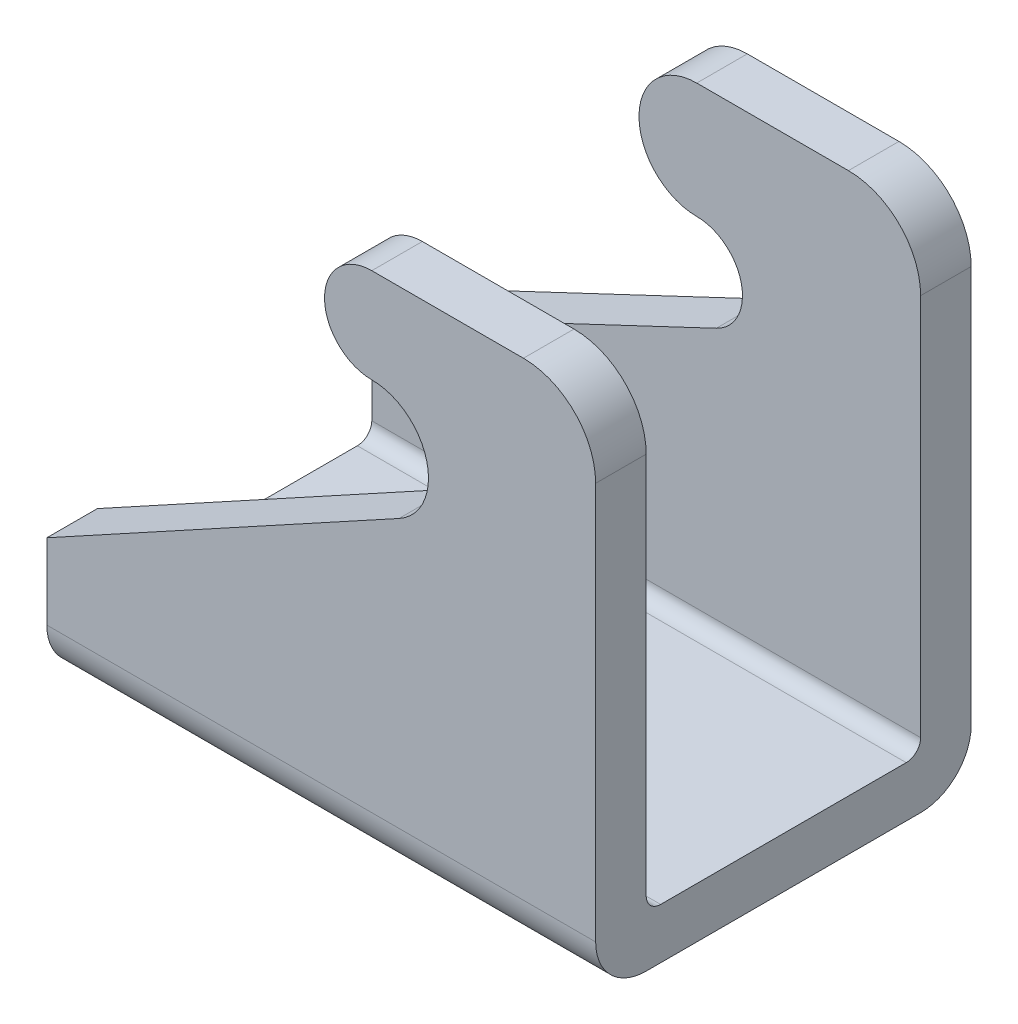
ISO-10303-21;
HEADER;
FILE_DESCRIPTION(('STEP AP214'),'2;1');
FILE_NAME('part.step','',(''),(''),'','','');
FILE_SCHEMA(('AUTOMOTIVE_DESIGN { 1 0 10303 214 1 1 1 1 }'));
ENDSEC;
DATA;
#1=APPLICATION_CONTEXT('core data for automotive mechanical design processes');
#2=APPLICATION_PROTOCOL_DEFINITION('international standard','automotive_design',2000,#1);
#3=PRODUCT_CONTEXT('',#1,'mechanical');
#4=PRODUCT('Part','Part','',(#3));
#5=PRODUCT_RELATED_PRODUCT_CATEGORY('part','',(#4));
#6=PRODUCT_DEFINITION_FORMATION('','',#4);
#7=PRODUCT_DEFINITION_CONTEXT('part definition',#1,'design');
#8=PRODUCT_DEFINITION('design','',#6,#7);
#9=PRODUCT_DEFINITION_SHAPE('','',#8);
#10=(LENGTH_UNIT() NAMED_UNIT(*) SI_UNIT(.MILLI.,.METRE.));
#11=(NAMED_UNIT(*) PLANE_ANGLE_UNIT() SI_UNIT($,.RADIAN.));
#12=(NAMED_UNIT(*) SI_UNIT($,.STERADIAN.) SOLID_ANGLE_UNIT());
#13=UNCERTAINTY_MEASURE_WITH_UNIT(LENGTH_MEASURE(1.E-05),#10,'distance_accuracy_value','');
#14=(GEOMETRIC_REPRESENTATION_CONTEXT(3) GLOBAL_UNCERTAINTY_ASSIGNED_CONTEXT((#13)) GLOBAL_UNIT_ASSIGNED_CONTEXT((#10,
#11,#12)) REPRESENTATION_CONTEXT('',''));
#15=CARTESIAN_POINT('',(0.,0.,0.));
#16=DIRECTION('',(0.,0.,1.));
#17=DIRECTION('',(1.,0.,0.));
#18=AXIS2_PLACEMENT_3D('',#15,#16,#17);
#19=CARTESIAN_POINT('',(38.,36.,-13.));
#20=DIRECTION('',(0.,1.,0.));
#21=DIRECTION('',(0.,0.,1.));
#22=AXIS2_PLACEMENT_3D('',#19,#20,#21);
#23=PLANE('',#22);
#24=DIRECTION('',(1.,0.,0.));
#25=VECTOR('',#24,1.);
#26=CARTESIAN_POINT('',(0.,36.,-9.5));
#27=LINE('',#26,#25);
#28=CARTESIAN_POINT('',(22.5,36.,-9.49999999999999));
#29=VERTEX_POINT('',#28);
#30=CARTESIAN_POINT('',(33.,36.,-9.5));
#31=VERTEX_POINT('',#30);
#32=EDGE_CURVE('E193',#29,#31,#27,.T.);
#33=ORIENTED_EDGE('',*,*,#32,.T.);
#34=DIRECTION('',(0.,0.,1.));
#35=VECTOR('',#34,1.);
#36=CARTESIAN_POINT('',(33.,36.,-13.));
#37=LINE('',#36,#35);
#38=CARTESIAN_POINT('',(33.,36.,-13.));
#39=VERTEX_POINT('',#38);
#40=EDGE_CURVE('E42',#31,#39,#37,.F.);
#41=ORIENTED_EDGE('',*,*,#40,.T.);
#42=DIRECTION('',(-1.,0.,0.));
#43=VECTOR('',#42,1.);
#44=CARTESIAN_POINT('',(38.,36.,-13.));
#45=LINE('',#44,#43);
#46=CARTESIAN_POINT('',(22.5,36.,-13.));
#47=VERTEX_POINT('',#46);
#48=EDGE_CURVE('E251',#39,#47,#45,.T.);
#49=ORIENTED_EDGE('',*,*,#48,.T.);
#50=DIRECTION('',(0.,0.,-1.));
#51=VECTOR('',#50,1.);
#52=CARTESIAN_POINT('',(22.5,36.,13.001));
#53=LINE('',#52,#51);
#54=EDGE_CURVE('E190',#29,#47,#53,.T.);
#55=ORIENTED_EDGE('',*,*,#54,.F.);
#56=EDGE_LOOP('',(#33,#41,#49,#55));
#57=FACE_BOUND('',#56,.T.);
#58=ADVANCED_FACE('F34',(#57),#23,.T.);
#59=DIRECTION('',(-1.,0.,0.));
#60=VECTOR('',#59,1.);
#61=CARTESIAN_POINT('',(38.,36.,13.));
#62=LINE('',#61,#60);
#63=CARTESIAN_POINT('',(33.,36.,13.));
#64=VERTEX_POINT('',#63);
#65=CARTESIAN_POINT('',(22.5,36.,13.));
#66=VERTEX_POINT('',#65);
#67=EDGE_CURVE('E248',#64,#66,#62,.T.);
#68=ORIENTED_EDGE('',*,*,#67,.F.);
#69=DIRECTION('',(0.,0.,1.));
#70=VECTOR('',#69,1.);
#71=CARTESIAN_POINT('',(33.,36.,-13.));
#72=LINE('',#71,#70);
#73=CARTESIAN_POINT('',(33.,36.,9.5));
#74=VERTEX_POINT('',#73);
#75=EDGE_CURVE('E317',#64,#74,#72,.F.);
#76=ORIENTED_EDGE('',*,*,#75,.T.);
#77=DIRECTION('',(1.,0.,0.));
#78=VECTOR('',#77,1.);
#79=CARTESIAN_POINT('',(0.,36.,9.5));
#80=LINE('',#79,#78);
#81=CARTESIAN_POINT('',(22.5,36.,9.49999999999999));
#82=VERTEX_POINT('',#81);
#83=EDGE_CURVE('E241',#82,#74,#80,.T.);
#84=ORIENTED_EDGE('',*,*,#83,.F.);
#85=DIRECTION('',(0.,0.,1.));
#86=VECTOR('',#85,1.);
#87=CARTESIAN_POINT('',(22.5,36.,-13.001));
#88=LINE('',#87,#86);
#89=EDGE_CURVE('E214',#82,#66,#88,.T.);
#90=ORIENTED_EDGE('',*,*,#89,.T.);
#91=EDGE_LOOP('',(#68,#76,#84,#90));
#92=FACE_BOUND('',#91,.T.);
#93=ADVANCED_FACE('F341',(#92),#23,.T.);
#94=CARTESIAN_POINT('',(38.,0.,-13.));
#95=DIRECTION('',(1.,0.,0.));
#96=DIRECTION('',(0.,0.,-1.));
#97=AXIS2_PLACEMENT_3D('',#94,#95,#96);
#98=PLANE('',#97);
#99=DIRECTION('',(0.,-1.,0.));
#100=VECTOR('',#99,1.);
#101=CARTESIAN_POINT('',(38.,36.,9.5));
#102=LINE('',#101,#100);
#103=CARTESIAN_POINT('',(38.,31.,9.5));
#104=VERTEX_POINT('',#103);
#105=CARTESIAN_POINT('',(38.,4.5,9.5));
#106=VERTEX_POINT('',#105);
#107=EDGE_CURVE('E231',#104,#106,#102,.T.);
#108=ORIENTED_EDGE('',*,*,#107,.F.);
#109=DIRECTION('',(0.,0.,1.));
#110=VECTOR('',#109,1.);
#111=CARTESIAN_POINT('',(38.,31.,-13.));
#112=LINE('',#111,#110);
#113=CARTESIAN_POINT('',(38.,31.,13.));
#114=VERTEX_POINT('',#113);
#115=EDGE_CURVE('E312',#104,#114,#112,.T.);
#116=ORIENTED_EDGE('',*,*,#115,.T.);
#117=DIRECTION('',(0.,1.,0.));
#118=VECTOR('',#117,1.);
#119=CARTESIAN_POINT('',(38.,0.,13.));
#120=LINE('',#119,#118);
#121=CARTESIAN_POINT('',(38.,3.5,13.));
#122=VERTEX_POINT('',#121);
#123=EDGE_CURVE('E254',#122,#114,#120,.T.);
#124=ORIENTED_EDGE('',*,*,#123,.F.);
#125=CARTESIAN_POINT('',(38.,3.5,9.5));
#126=DIRECTION('',(1.,0.,0.));
#127=DIRECTION('',(0.,0.,-1.));
#128=AXIS2_PLACEMENT_3D('',#125,#126,#127);
#129=CIRCLE('',#128,3.5);
#130=CARTESIAN_POINT('',(38.,0.,9.5));
#131=VERTEX_POINT('',#130);
#132=EDGE_CURVE('E296',#122,#131,#129,.T.);
#133=ORIENTED_EDGE('',*,*,#132,.T.);
#134=DIRECTION('',(0.,0.,1.));
#135=VECTOR('',#134,1.);
#136=CARTESIAN_POINT('',(38.,0.,-13.));
#137=LINE('',#136,#135);
#138=CARTESIAN_POINT('',(38.,0.,-9.5));
#139=VERTEX_POINT('',#138);
#140=EDGE_CURVE('E267',#139,#131,#137,.T.);
#141=ORIENTED_EDGE('',*,*,#140,.F.);
#142=CARTESIAN_POINT('',(38.,3.5,-9.5));
#143=DIRECTION('',(1.,0.,0.));
#144=DIRECTION('',(0.,0.,-1.));
#145=AXIS2_PLACEMENT_3D('',#142,#143,#144);
#146=CIRCLE('',#145,3.5);
#147=CARTESIAN_POINT('',(38.,3.5,-13.));
#148=VERTEX_POINT('',#147);
#149=EDGE_CURVE('E294',#139,#148,#146,.T.);
#150=ORIENTED_EDGE('',*,*,#149,.T.);
#151=DIRECTION('',(0.,1.,0.));
#152=VECTOR('',#151,1.);
#153=CARTESIAN_POINT('',(38.,0.,-13.));
#154=LINE('',#153,#152);
#155=CARTESIAN_POINT('',(38.,31.,-13.));
#156=VERTEX_POINT('',#155);
#157=EDGE_CURVE('E257',#148,#156,#154,.T.);
#158=ORIENTED_EDGE('',*,*,#157,.T.);
#159=DIRECTION('',(0.,0.,1.));
#160=VECTOR('',#159,1.);
#161=CARTESIAN_POINT('',(38.,31.,-13.));
#162=LINE('',#161,#160);
#163=CARTESIAN_POINT('',(38.,31.,-9.5));
#164=VERTEX_POINT('',#163);
#165=EDGE_CURVE('E309',#156,#164,#162,.T.);
#166=ORIENTED_EDGE('',*,*,#165,.T.);
#167=DIRECTION('',(0.,1.,0.));
#168=VECTOR('',#167,1.);
#169=CARTESIAN_POINT('',(38.,3.5,-9.5));
#170=LINE('',#169,#168);
#171=CARTESIAN_POINT('',(38.,4.5,-9.5));
#172=VERTEX_POINT('',#171);
#173=EDGE_CURVE('E236',#172,#164,#170,.T.);
#174=ORIENTED_EDGE('',*,*,#173,.F.);
#175=CARTESIAN_POINT('',(38.,4.5,-8.5));
#176=DIRECTION('',(1.,0.,0.));
#177=DIRECTION('',(0.,0.,-1.));
#178=AXIS2_PLACEMENT_3D('',#175,#176,#177);
#179=CIRCLE('',#178,1.);
#180=CARTESIAN_POINT('',(38.,3.5,-8.5));
#181=VERTEX_POINT('',#180);
#182=EDGE_CURVE('E282',#172,#181,#179,.F.);
#183=ORIENTED_EDGE('',*,*,#182,.T.);
#184=DIRECTION('',(0.,0.,-1.));
#185=VECTOR('',#184,1.);
#186=CARTESIAN_POINT('',(38.,3.5,9.5));
#187=LINE('',#186,#185);
#188=CARTESIAN_POINT('',(38.,3.5,8.5));
#189=VERTEX_POINT('',#188);
#190=EDGE_CURVE('E243',#189,#181,#187,.T.);
#191=ORIENTED_EDGE('',*,*,#190,.F.);
#192=CARTESIAN_POINT('',(38.,4.5,8.5));
#193=DIRECTION('',(1.,0.,0.));
#194=DIRECTION('',(0.,0.,-1.));
#195=AXIS2_PLACEMENT_3D('',#192,#193,#194);
#196=CIRCLE('',#195,1.);
#197=EDGE_CURVE('E286',#189,#106,#196,.F.);
#198=ORIENTED_EDGE('',*,*,#197,.T.);
#199=EDGE_LOOP('',(#108,#116,#124,#133,#141,#150,#158,#166,#174,#183,#191,#198));
#200=FACE_BOUND('',#199,.T.);
#201=ADVANCED_FACE('F331',(#200),#98,.T.);
#202=CARTESIAN_POINT('',(0.,0.,-13.));
#203=DIRECTION('',(0.,-1.,0.));
#204=DIRECTION('',(0.,0.,-1.));
#205=AXIS2_PLACEMENT_3D('',#202,#203,#204);
#206=PLANE('',#205);
#207=ORIENTED_EDGE('',*,*,#140,.T.);
#208=DIRECTION('',(1.,0.,0.));
#209=VECTOR('',#208,1.);
#210=CARTESIAN_POINT('',(0.,0.,9.5));
#211=LINE('',#210,#209);
#212=CARTESIAN_POINT('',(0.,0.,9.5));
#213=VERTEX_POINT('',#212);
#214=EDGE_CURVE('E301',#131,#213,#211,.F.);
#215=ORIENTED_EDGE('',*,*,#214,.T.);
#216=DIRECTION('',(0.,0.,1.));
#217=VECTOR('',#216,1.);
#218=CARTESIAN_POINT('',(0.,0.,-13.));
#219=LINE('',#218,#217);
#220=CARTESIAN_POINT('',(0.,0.,-9.5));
#221=VERTEX_POINT('',#220);
#222=EDGE_CURVE('E260',#221,#213,#219,.T.);
#223=ORIENTED_EDGE('',*,*,#222,.F.);
#224=DIRECTION('',(1.,0.,0.));
#225=VECTOR('',#224,1.);
#226=CARTESIAN_POINT('',(38.,0.,-9.5));
#227=LINE('',#226,#225);
#228=EDGE_CURVE('E298',#221,#139,#227,.T.);
#229=ORIENTED_EDGE('',*,*,#228,.T.);
#230=EDGE_LOOP('',(#207,#215,#223,#229));
#231=FACE_BOUND('',#230,.T.);
#232=ADVANCED_FACE('F365',(#231),#206,.T.);
#233=CARTESIAN_POINT('',(0.,36.,-13.));
#234=DIRECTION('',(-1.,0.,0.));
#235=DIRECTION('',(0.,0.,1.));
#236=AXIS2_PLACEMENT_3D('',#233,#234,#235);
#237=PLANE('',#236);
#238=ORIENTED_EDGE('',*,*,#222,.T.);
#239=CARTESIAN_POINT('',(0.,3.5,9.5));
#240=DIRECTION('',(-1.,0.,0.));
#241=DIRECTION('',(0.,0.,1.));
#242=AXIS2_PLACEMENT_3D('',#239,#240,#241);
#243=CIRCLE('',#242,3.5);
#244=CARTESIAN_POINT('',(0.,3.5,13.));
#245=VERTEX_POINT('',#244);
#246=EDGE_CURVE('E305',#213,#245,#243,.T.);
#247=ORIENTED_EDGE('',*,*,#246,.T.);
#248=DIRECTION('',(0.,-1.,0.));
#249=VECTOR('',#248,1.);
#250=CARTESIAN_POINT('',(0.,36.,13.));
#251=LINE('',#250,#249);
#252=CARTESIAN_POINT('',(0.,8.73428883746661,13.));
#253=VERTEX_POINT('',#252);
#254=EDGE_CURVE('E262',#253,#245,#251,.T.);
#255=ORIENTED_EDGE('',*,*,#254,.F.);
#256=DIRECTION('',(0.,0.,1.));
#257=VECTOR('',#256,1.);
#258=CARTESIAN_POINT('',(0.,8.73428883746661,-13.001));
#259=LINE('',#258,#257);
#260=CARTESIAN_POINT('',(0.,8.73428883746661,9.49999999999999));
#261=VERTEX_POINT('',#260);
#262=EDGE_CURVE('E226',#261,#253,#259,.T.);
#263=ORIENTED_EDGE('',*,*,#262,.F.);
#264=DIRECTION('',(0.,-1.,0.));
#265=VECTOR('',#264,1.);
#266=CARTESIAN_POINT('',(0.,36.,9.5));
#267=LINE('',#266,#265);
#268=CARTESIAN_POINT('',(0.,4.5,9.5));
#269=VERTEX_POINT('',#268);
#270=EDGE_CURVE('E232',#261,#269,#267,.T.);
#271=ORIENTED_EDGE('',*,*,#270,.T.);
#272=CARTESIAN_POINT('',(0.,4.5,8.5));
#273=DIRECTION('',(-1.,0.,0.));
#274=DIRECTION('',(0.,0.,1.));
#275=AXIS2_PLACEMENT_3D('',#272,#273,#274);
#276=CIRCLE('',#275,1.);
#277=CARTESIAN_POINT('',(0.,3.5,8.5));
#278=VERTEX_POINT('',#277);
#279=EDGE_CURVE('E289',#269,#278,#276,.F.);
#280=ORIENTED_EDGE('',*,*,#279,.T.);
#281=DIRECTION('',(0.,0.,-1.));
#282=VECTOR('',#281,1.);
#283=CARTESIAN_POINT('',(0.,3.5,9.5));
#284=LINE('',#283,#282);
#285=CARTESIAN_POINT('',(0.,3.5,-8.5));
#286=VERTEX_POINT('',#285);
#287=EDGE_CURVE('E235',#278,#286,#284,.T.);
#288=ORIENTED_EDGE('',*,*,#287,.T.);
#289=CARTESIAN_POINT('',(0.,4.5,-8.5));
#290=DIRECTION('',(-1.,0.,0.));
#291=DIRECTION('',(0.,0.,1.));
#292=AXIS2_PLACEMENT_3D('',#289,#290,#291);
#293=CIRCLE('',#292,1.);
#294=CARTESIAN_POINT('',(0.,4.5,-9.5));
#295=VERTEX_POINT('',#294);
#296=EDGE_CURVE('E284',#286,#295,#293,.F.);
#297=ORIENTED_EDGE('',*,*,#296,.T.);
#298=DIRECTION('',(0.,1.,0.));
#299=VECTOR('',#298,1.);
#300=CARTESIAN_POINT('',(0.,3.5,-9.5));
#301=LINE('',#300,#299);
#302=CARTESIAN_POINT('',(0.,10.7,-9.49999999999999));
#303=VERTEX_POINT('',#302);
#304=EDGE_CURVE('E239',#295,#303,#301,.T.);
#305=ORIENTED_EDGE('',*,*,#304,.T.);
#306=DIRECTION('',(0.,0.,-1.));
#307=VECTOR('',#306,1.);
#308=CARTESIAN_POINT('',(0.,10.7,13.001));
#309=LINE('',#308,#307);
#310=CARTESIAN_POINT('',(0.,10.7,-13.));
#311=VERTEX_POINT('',#310);
#312=EDGE_CURVE('E203',#303,#311,#309,.T.);
#313=ORIENTED_EDGE('',*,*,#312,.T.);
#314=DIRECTION('',(0.,-1.,0.));
#315=VECTOR('',#314,1.);
#316=CARTESIAN_POINT('',(0.,36.,-13.));
#317=LINE('',#316,#315);
#318=CARTESIAN_POINT('',(0.,3.5,-13.));
#319=VERTEX_POINT('',#318);
#320=EDGE_CURVE('E253',#311,#319,#317,.T.);
#321=ORIENTED_EDGE('',*,*,#320,.T.);
#322=CARTESIAN_POINT('',(0.,3.5,-9.5));
#323=DIRECTION('',(-1.,0.,0.));
#324=DIRECTION('',(0.,0.,1.));
#325=AXIS2_PLACEMENT_3D('',#322,#323,#324);
#326=CIRCLE('',#325,3.5);
#327=EDGE_CURVE('E303',#319,#221,#326,.T.);
#328=ORIENTED_EDGE('',*,*,#327,.T.);
#329=EDGE_LOOP('',(#238,#247,#255,#263,#271,#280,#288,#297,#305,#313,#321,#328));
#330=FACE_BOUND('',#329,.T.);
#331=ADVANCED_FACE('F357',(#330),#237,.T.);
#332=CARTESIAN_POINT('',(0.,0.,-13.));
#333=DIRECTION('',(0.,0.,1.));
#334=DIRECTION('',(1.,0.,0.));
#335=AXIS2_PLACEMENT_3D('',#332,#333,#334);
#336=PLANE('',#335);
#337=ORIENTED_EDGE('',*,*,#48,.F.);
#338=CARTESIAN_POINT('',(33.,31.,-13.));
#339=DIRECTION('',(0.,0.,1.));
#340=DIRECTION('',(1.,0.,0.));
#341=AXIS2_PLACEMENT_3D('',#338,#339,#340);
#342=CIRCLE('',#341,5.);
#343=EDGE_CURVE('E11',#39,#156,#342,.F.);
#344=ORIENTED_EDGE('',*,*,#343,.T.);
#345=ORIENTED_EDGE('',*,*,#157,.F.);
#346=DIRECTION('',(1.,0.,0.));
#347=VECTOR('',#346,1.);
#348=CARTESIAN_POINT('',(0.,3.5,-13.));
#349=LINE('',#348,#347);
#350=EDGE_CURVE('E307',#148,#319,#349,.F.);
#351=ORIENTED_EDGE('',*,*,#350,.T.);
#352=ORIENTED_EDGE('',*,*,#320,.F.);
#353=DIRECTION('',(-0.904118037486185,-0.427282780242933,0.));
#354=VECTOR('',#353,1.);
#355=CARTESIAN_POINT('',(23.8525398198357,21.972620506955,-13.));
#356=LINE('',#355,#354);
#357=CARTESIAN_POINT('',(23.8525398198357,21.972620506955,-13.));
#358=VERTEX_POINT('',#357);
#359=EDGE_CURVE('E182',#358,#311,#356,.T.);
#360=ORIENTED_EDGE('',*,*,#359,.F.);
#361=CARTESIAN_POINT('',(22.5,24.8345557500194,-13.));
#362=DIRECTION('',(0.,0.,-1.));
#363=DIRECTION('',(-1.,0.,0.));
#364=AXIS2_PLACEMENT_3D('',#361,#362,#363);
#365=CIRCLE('',#364,3.16544424998061);
#366=CARTESIAN_POINT('',(22.5,28.,-13.));
#367=VERTEX_POINT('',#366);
#368=EDGE_CURVE('E196',#367,#358,#365,.T.);
#369=ORIENTED_EDGE('',*,*,#368,.F.);
#370=CARTESIAN_POINT('',(22.5,32.,-13.));
#371=DIRECTION('',(0.,0.,1.));
#372=DIRECTION('',(1.,0.,0.));
#373=AXIS2_PLACEMENT_3D('',#370,#371,#372);
#374=CIRCLE('',#373,4.);
#375=EDGE_CURVE('E177',#47,#367,#374,.T.);
#376=ORIENTED_EDGE('',*,*,#375,.F.);
#377=EDGE_LOOP('',(#337,#344,#345,#351,#352,#360,#369,#376));
#378=FACE_BOUND('',#377,.T.);
#379=ADVANCED_FACE('F374',(#378),#336,.F.);
#380=CARTESIAN_POINT('',(0.,0.,13.));
#381=DIRECTION('',(0.,0.,1.));
#382=DIRECTION('',(1.,0.,0.));
#383=AXIS2_PLACEMENT_3D('',#380,#381,#382);
#384=PLANE('',#383);
#385=ORIENTED_EDGE('',*,*,#123,.T.);
#386=CARTESIAN_POINT('',(33.,31.,13.));
#387=DIRECTION('',(0.,0.,1.));
#388=DIRECTION('',(1.,0.,0.));
#389=AXIS2_PLACEMENT_3D('',#386,#387,#388);
#390=CIRCLE('',#389,5.);
#391=EDGE_CURVE('E315',#114,#64,#390,.T.);
#392=ORIENTED_EDGE('',*,*,#391,.T.);
#393=ORIENTED_EDGE('',*,*,#67,.T.);
#394=CARTESIAN_POINT('',(22.5,32.7264147347503,13.));
#395=DIRECTION('',(0.,0.,-1.));
#396=DIRECTION('',(-1.,0.,0.));
#397=AXIS2_PLACEMENT_3D('',#394,#395,#396);
#398=CIRCLE('',#397,3.27358526524967);
#399=CARTESIAN_POINT('',(22.5,29.4528294695007,13.));
#400=VERTEX_POINT('',#399);
#401=EDGE_CURVE('E215',#400,#66,#398,.T.);
#402=ORIENTED_EDGE('',*,*,#401,.F.);
#403=CARTESIAN_POINT('',(22.5,25.5271128726081,13.));
#404=DIRECTION('',(0.,0.,1.));
#405=DIRECTION('',(1.,0.,0.));
#406=AXIS2_PLACEMENT_3D('',#403,#404,#405);
#407=CIRCLE('',#406,3.92571659689259);
#408=CARTESIAN_POINT('',(24.38509945709,22.0836188859723,13.));
#409=VERTEX_POINT('',#408);
#410=EDGE_CURVE('E209',#409,#400,#407,.T.);
#411=ORIENTED_EDGE('',*,*,#410,.F.);
#412=DIRECTION('',(0.87716316286344,0.48019244654139,0.));
#413=VECTOR('',#412,1.);
#414=CARTESIAN_POINT('',(0.,8.73428883746661,13.));
#415=LINE('',#414,#413);
#416=EDGE_CURVE('E211',#253,#409,#415,.T.);
#417=ORIENTED_EDGE('',*,*,#416,.F.);
#418=ORIENTED_EDGE('',*,*,#254,.T.);
#419=DIRECTION('',(1.,0.,0.));
#420=VECTOR('',#419,1.);
#421=CARTESIAN_POINT('',(0.,3.5,13.));
#422=LINE('',#421,#420);
#423=EDGE_CURVE('E291',#245,#122,#422,.T.);
#424=ORIENTED_EDGE('',*,*,#423,.T.);
#425=EDGE_LOOP('',(#385,#392,#393,#402,#411,#417,#418,#424));
#426=FACE_BOUND('',#425,.T.);
#427=ADVANCED_FACE('F338',(#426),#384,.T.);
#428=CARTESIAN_POINT('',(0.,3.5,-9.5));
#429=DIRECTION('',(0.,0.,-1.));
#430=DIRECTION('',(-1.,0.,0.));
#431=AXIS2_PLACEMENT_3D('',#428,#429,#430);
#432=PLANE('',#431);
#433=ORIENTED_EDGE('',*,*,#173,.T.);
#434=CARTESIAN_POINT('',(33.,31.,-9.5));
#435=DIRECTION('',(0.,0.,-1.));
#436=DIRECTION('',(-1.,0.,0.));
#437=AXIS2_PLACEMENT_3D('',#434,#435,#436);
#438=CIRCLE('',#437,5.);
#439=EDGE_CURVE('E56',#164,#31,#438,.F.);
#440=ORIENTED_EDGE('',*,*,#439,.T.);
#441=ORIENTED_EDGE('',*,*,#32,.F.);
#442=CARTESIAN_POINT('',(22.5,32.,-9.5));
#443=DIRECTION('',(0.,0.,-1.));
#444=DIRECTION('',(-1.,0.,0.));
#445=AXIS2_PLACEMENT_3D('',#442,#443,#444);
#446=CIRCLE('',#445,4.);
#447=CARTESIAN_POINT('',(22.5,28.,-9.5));
#448=VERTEX_POINT('',#447);
#449=EDGE_CURVE('E174',#448,#29,#446,.T.);
#450=ORIENTED_EDGE('',*,*,#449,.F.);
#451=CARTESIAN_POINT('',(22.5,24.8345557500194,-9.5));
#452=DIRECTION('',(0.,0.,-1.));
#453=DIRECTION('',(-1.,0.,0.));
#454=AXIS2_PLACEMENT_3D('',#451,#452,#453);
#455=CIRCLE('',#454,3.16544424998061);
#456=CARTESIAN_POINT('',(23.8525398198357,21.972620506955,-9.5));
#457=VERTEX_POINT('',#456);
#458=EDGE_CURVE('E186',#457,#448,#455,.F.);
#459=ORIENTED_EDGE('',*,*,#458,.F.);
#460=DIRECTION('',(0.904118037486185,0.427282780242933,0.));
#461=VECTOR('',#460,1.);
#462=CARTESIAN_POINT('',(23.8525398198357,21.972620506955,-9.5));
#463=LINE('',#462,#461);
#464=EDGE_CURVE('E194',#303,#457,#463,.T.);
#465=ORIENTED_EDGE('',*,*,#464,.F.);
#466=ORIENTED_EDGE('',*,*,#304,.F.);
#467=DIRECTION('',(1.,0.,0.));
#468=VECTOR('',#467,1.);
#469=CARTESIAN_POINT('',(38.,4.5,-9.5));
#470=LINE('',#469,#468);
#471=EDGE_CURVE('E270',#295,#172,#470,.T.);
#472=ORIENTED_EDGE('',*,*,#471,.T.);
#473=EDGE_LOOP('',(#433,#440,#441,#450,#459,#465,#466,#472));
#474=FACE_BOUND('',#473,.T.);
#475=ADVANCED_FACE('F192',(#474),#432,.F.);
#476=CARTESIAN_POINT('',(0.,3.5,9.5));
#477=DIRECTION('',(0.,-1.,0.));
#478=DIRECTION('',(0.,0.,-1.));
#479=AXIS2_PLACEMENT_3D('',#476,#477,#478);
#480=PLANE('',#479);
#481=ORIENTED_EDGE('',*,*,#190,.T.);
#482=DIRECTION('',(1.,0.,0.));
#483=VECTOR('',#482,1.);
#484=CARTESIAN_POINT('',(0.,3.5,-8.5));
#485=LINE('',#484,#483);
#486=EDGE_CURVE('E278',#181,#286,#485,.F.);
#487=ORIENTED_EDGE('',*,*,#486,.T.);
#488=ORIENTED_EDGE('',*,*,#287,.F.);
#489=DIRECTION('',(1.,0.,0.));
#490=VECTOR('',#489,1.);
#491=CARTESIAN_POINT('',(38.,3.5,8.5));
#492=LINE('',#491,#490);
#493=EDGE_CURVE('E275',#278,#189,#492,.T.);
#494=ORIENTED_EDGE('',*,*,#493,.T.);
#495=EDGE_LOOP('',(#481,#487,#488,#494));
#496=FACE_BOUND('',#495,.T.);
#497=ADVANCED_FACE('F386',(#496),#480,.F.);
#498=CARTESIAN_POINT('',(0.,36.,9.5));
#499=DIRECTION('',(0.,0.,1.));
#500=DIRECTION('',(1.,0.,0.));
#501=AXIS2_PLACEMENT_3D('',#498,#499,#500);
#502=PLANE('',#501);
#503=ORIENTED_EDGE('',*,*,#83,.T.);
#504=CARTESIAN_POINT('',(33.,31.,9.5));
#505=DIRECTION('',(0.,0.,1.));
#506=DIRECTION('',(1.,0.,0.));
#507=AXIS2_PLACEMENT_3D('',#504,#505,#506);
#508=CIRCLE('',#507,5.);
#509=EDGE_CURVE('E319',#74,#104,#508,.F.);
#510=ORIENTED_EDGE('',*,*,#509,.T.);
#511=ORIENTED_EDGE('',*,*,#107,.T.);
#512=DIRECTION('',(1.,0.,0.));
#513=VECTOR('',#512,1.);
#514=CARTESIAN_POINT('',(0.,4.5,9.5));
#515=LINE('',#514,#513);
#516=EDGE_CURVE('E280',#106,#269,#515,.F.);
#517=ORIENTED_EDGE('',*,*,#516,.T.);
#518=ORIENTED_EDGE('',*,*,#270,.F.);
#519=DIRECTION('',(-0.87716316286344,-0.48019244654139,0.));
#520=VECTOR('',#519,1.);
#521=CARTESIAN_POINT('',(0.,8.73428883746661,9.5));
#522=LINE('',#521,#520);
#523=CARTESIAN_POINT('',(24.38509945709,22.0836188859723,9.49999999999999));
#524=VERTEX_POINT('',#523);
#525=EDGE_CURVE('E210',#524,#261,#522,.T.);
#526=ORIENTED_EDGE('',*,*,#525,.F.);
#527=CARTESIAN_POINT('',(22.5,25.5271128726081,9.5));
#528=DIRECTION('',(0.,0.,1.));
#529=DIRECTION('',(1.,0.,0.));
#530=AXIS2_PLACEMENT_3D('',#527,#528,#529);
#531=CIRCLE('',#530,3.92571659689259);
#532=CARTESIAN_POINT('',(22.5,29.4528294695006,9.5));
#533=VERTEX_POINT('',#532);
#534=EDGE_CURVE('E189',#533,#524,#531,.F.);
#535=ORIENTED_EDGE('',*,*,#534,.F.);
#536=CARTESIAN_POINT('',(22.5,32.7264147347503,9.5));
#537=DIRECTION('',(0.,0.,1.));
#538=DIRECTION('',(1.,0.,0.));
#539=AXIS2_PLACEMENT_3D('',#536,#537,#538);
#540=CIRCLE('',#539,3.27358526524967);
#541=EDGE_CURVE('E207',#82,#533,#540,.T.);
#542=ORIENTED_EDGE('',*,*,#541,.F.);
#543=EDGE_LOOP('',(#503,#510,#511,#517,#518,#526,#535,#542));
#544=FACE_BOUND('',#543,.T.);
#545=ADVANCED_FACE('F324',(#544),#502,.F.);
#546=CARTESIAN_POINT('',(22.5,32.7264147347503,-13.001));
#547=DIRECTION('',(0.,0.,1.));
#548=DIRECTION('',(1.,0.,0.));
#549=AXIS2_PLACEMENT_3D('',#546,#547,#548);
#550=CYLINDRICAL_SURFACE('',#549,3.27358526524967);
#551=ORIENTED_EDGE('',*,*,#541,.T.);
#552=DIRECTION('',(0.,0.,1.));
#553=VECTOR('',#552,1.);
#554=CARTESIAN_POINT('',(22.5,29.4528294695007,-13.001));
#555=LINE('',#554,#553);
#556=EDGE_CURVE('E225',#533,#400,#555,.T.);
#557=ORIENTED_EDGE('',*,*,#556,.T.);
#558=ORIENTED_EDGE('',*,*,#401,.T.);
#559=ORIENTED_EDGE('',*,*,#89,.F.);
#560=EDGE_LOOP('',(#551,#557,#558,#559));
#561=FACE_BOUND('',#560,.T.);
#562=ADVANCED_FACE('F343',(#561),#550,.T.);
#563=CARTESIAN_POINT('',(0.,8.73428883746661,-13.001));
#564=DIRECTION('',(0.48019244654139,-0.87716316286344,0.));
#565=DIRECTION('',(0.87716316286344,0.48019244654139,0.));
#566=AXIS2_PLACEMENT_3D('',#563,#564,#565);
#567=PLANE('',#566);
#568=ORIENTED_EDGE('',*,*,#525,.T.);
#569=ORIENTED_EDGE('',*,*,#262,.T.);
#570=ORIENTED_EDGE('',*,*,#416,.T.);
#571=DIRECTION('',(0.,0.,1.));
#572=VECTOR('',#571,1.);
#573=CARTESIAN_POINT('',(24.38509945709,22.0836188859723,-13.001));
#574=LINE('',#573,#572);
#575=EDGE_CURVE('E223',#524,#409,#574,.T.);
#576=ORIENTED_EDGE('',*,*,#575,.F.);
#577=EDGE_LOOP('',(#568,#569,#570,#576));
#578=FACE_BOUND('',#577,.T.);
#579=ADVANCED_FACE('F552',(#578),#567,.F.);
#580=CARTESIAN_POINT('',(22.5,25.5271128726081,-13.001));
#581=DIRECTION('',(0.,0.,1.));
#582=DIRECTION('',(1.,0.,0.));
#583=AXIS2_PLACEMENT_3D('',#580,#581,#582);
#584=CYLINDRICAL_SURFACE('',#583,3.92571659689259);
#585=ORIENTED_EDGE('',*,*,#534,.T.);
#586=ORIENTED_EDGE('',*,*,#575,.T.);
#587=ORIENTED_EDGE('',*,*,#410,.T.);
#588=ORIENTED_EDGE('',*,*,#556,.F.);
#589=EDGE_LOOP('',(#585,#586,#587,#588));
#590=FACE_BOUND('',#589,.T.);
#591=ADVANCED_FACE('F349',(#590),#584,.F.);
#592=CARTESIAN_POINT('',(22.5,32.,13.001));
#593=DIRECTION('',(0.,0.,-1.));
#594=DIRECTION('',(-1.,0.,0.));
#595=AXIS2_PLACEMENT_3D('',#592,#593,#594);
#596=CYLINDRICAL_SURFACE('',#595,4.);
#597=ORIENTED_EDGE('',*,*,#449,.T.);
#598=ORIENTED_EDGE('',*,*,#54,.T.);
#599=ORIENTED_EDGE('',*,*,#375,.T.);
#600=DIRECTION('',(0.,0.,-1.));
#601=VECTOR('',#600,1.);
#602=CARTESIAN_POINT('',(22.5,28.,13.001));
#603=LINE('',#602,#601);
#604=EDGE_CURVE('E169',#448,#367,#603,.T.);
#605=ORIENTED_EDGE('',*,*,#604,.F.);
#606=EDGE_LOOP('',(#597,#598,#599,#605));
#607=FACE_BOUND('',#606,.T.);
#608=ADVANCED_FACE('F171',(#607),#596,.T.);
#609=CARTESIAN_POINT('',(23.8525398198357,21.972620506955,13.001));
#610=DIRECTION('',(0.427282780242933,-0.904118037486185,0.));
#611=DIRECTION('',(0.904118037486185,0.427282780242933,0.));
#612=AXIS2_PLACEMENT_3D('',#609,#610,#611);
#613=PLANE('',#612);
#614=ORIENTED_EDGE('',*,*,#464,.T.);
#615=DIRECTION('',(0.,0.,-1.));
#616=VECTOR('',#615,1.);
#617=CARTESIAN_POINT('',(23.8525398198357,21.972620506955,13.001));
#618=LINE('',#617,#616);
#619=EDGE_CURVE('E181',#457,#358,#618,.T.);
#620=ORIENTED_EDGE('',*,*,#619,.T.);
#621=ORIENTED_EDGE('',*,*,#359,.T.);
#622=ORIENTED_EDGE('',*,*,#312,.F.);
#623=EDGE_LOOP('',(#614,#620,#621,#622));
#624=FACE_BOUND('',#623,.T.);
#625=ADVANCED_FACE('F394',(#624),#613,.F.);
#626=CARTESIAN_POINT('',(22.5,24.8345557500194,13.001));
#627=DIRECTION('',(0.,0.,-1.));
#628=DIRECTION('',(-1.,0.,0.));
#629=AXIS2_PLACEMENT_3D('',#626,#627,#628);
#630=CYLINDRICAL_SURFACE('',#629,3.16544424998061);
#631=ORIENTED_EDGE('',*,*,#458,.T.);
#632=ORIENTED_EDGE('',*,*,#604,.T.);
#633=ORIENTED_EDGE('',*,*,#368,.T.);
#634=ORIENTED_EDGE('',*,*,#619,.F.);
#635=EDGE_LOOP('',(#631,#632,#633,#634));
#636=FACE_BOUND('',#635,.T.);
#637=ADVANCED_FACE('F187',(#636),#630,.F.);
#638=CARTESIAN_POINT('',(0.,4.5,-8.5));
#639=DIRECTION('',(-1.,0.,0.));
#640=DIRECTION('',(0.,0.,1.));
#641=AXIS2_PLACEMENT_3D('',#638,#639,#640);
#642=CYLINDRICAL_SURFACE('',#641,1.);
#643=ORIENTED_EDGE('',*,*,#296,.F.);
#644=ORIENTED_EDGE('',*,*,#486,.F.);
#645=ORIENTED_EDGE('',*,*,#182,.F.);
#646=ORIENTED_EDGE('',*,*,#471,.F.);
#647=EDGE_LOOP('',(#643,#644,#645,#646));
#648=FACE_BOUND('',#647,.T.);
#649=ADVANCED_FACE('F383',(#648),#642,.F.);
#650=CARTESIAN_POINT('',(0.,4.5,8.5));
#651=DIRECTION('',(-1.,0.,0.));
#652=DIRECTION('',(0.,0.,1.));
#653=AXIS2_PLACEMENT_3D('',#650,#651,#652);
#654=CYLINDRICAL_SURFACE('',#653,1.);
#655=ORIENTED_EDGE('',*,*,#279,.F.);
#656=ORIENTED_EDGE('',*,*,#516,.F.);
#657=ORIENTED_EDGE('',*,*,#197,.F.);
#658=ORIENTED_EDGE('',*,*,#493,.F.);
#659=EDGE_LOOP('',(#655,#656,#657,#658));
#660=FACE_BOUND('',#659,.T.);
#661=ADVANCED_FACE('F391',(#660),#654,.F.);
#662=CARTESIAN_POINT('',(0.,3.5,9.5));
#663=DIRECTION('',(1.,0.,0.));
#664=DIRECTION('',(0.,0.,-1.));
#665=AXIS2_PLACEMENT_3D('',#662,#663,#664);
#666=CYLINDRICAL_SURFACE('',#665,3.5);
#667=ORIENTED_EDGE('',*,*,#246,.F.);
#668=ORIENTED_EDGE('',*,*,#214,.F.);
#669=ORIENTED_EDGE('',*,*,#132,.F.);
#670=ORIENTED_EDGE('',*,*,#423,.F.);
#671=EDGE_LOOP('',(#667,#668,#669,#670));
#672=FACE_BOUND('',#671,.T.);
#673=ADVANCED_FACE('F362',(#672),#666,.T.);
#674=CARTESIAN_POINT('',(0.,3.5,-9.5));
#675=DIRECTION('',(-1.,0.,0.));
#676=DIRECTION('',(0.,0.,1.));
#677=AXIS2_PLACEMENT_3D('',#674,#675,#676);
#678=CYLINDRICAL_SURFACE('',#677,3.5);
#679=ORIENTED_EDGE('',*,*,#327,.F.);
#680=ORIENTED_EDGE('',*,*,#350,.F.);
#681=ORIENTED_EDGE('',*,*,#149,.F.);
#682=ORIENTED_EDGE('',*,*,#228,.F.);
#683=EDGE_LOOP('',(#679,#680,#681,#682));
#684=FACE_BOUND('',#683,.T.);
#685=ADVANCED_FACE('F369',(#684),#678,.T.);
#686=CARTESIAN_POINT('',(33.,31.,-13.));
#687=DIRECTION('',(0.,0.,1.));
#688=DIRECTION('',(1.,0.,0.));
#689=AXIS2_PLACEMENT_3D('',#686,#687,#688);
#690=CYLINDRICAL_SURFACE('',#689,5.);
#691=ORIENTED_EDGE('',*,*,#509,.F.);
#692=ORIENTED_EDGE('',*,*,#75,.F.);
#693=ORIENTED_EDGE('',*,*,#391,.F.);
#694=ORIENTED_EDGE('',*,*,#115,.F.);
#695=EDGE_LOOP('',(#691,#692,#693,#694));
#696=FACE_BOUND('',#695,.T.);
#697=ADVANCED_FACE('F335',(#696),#690,.T.);
#698=CARTESIAN_POINT('',(33.,31.,-13.));
#699=DIRECTION('',(0.,0.,1.));
#700=DIRECTION('',(1.,0.,0.));
#701=AXIS2_PLACEMENT_3D('',#698,#699,#700);
#702=CYLINDRICAL_SURFACE('',#701,5.);
#703=ORIENTED_EDGE('',*,*,#343,.F.);
#704=ORIENTED_EDGE('',*,*,#40,.F.);
#705=ORIENTED_EDGE('',*,*,#439,.F.);
#706=ORIENTED_EDGE('',*,*,#165,.F.);
#707=EDGE_LOOP('',(#703,#704,#705,#706));
#708=FACE_BOUND('',#707,.T.);
#709=ADVANCED_FACE('F36',(#708),#702,.T.);
#710=CLOSED_SHELL('',(#58,#93,#201,#232,#331,#379,#427,#475,#497,#545,#562,#579,#591,#608,#625,
#637,#649,#661,#673,#685,#697,#709));
#711=MANIFOLD_SOLID_BREP('B2',#710);
#712=ADVANCED_BREP_SHAPE_REPRESENTATION('',(#18,#711),#14);
#713=SHAPE_DEFINITION_REPRESENTATION(#9,#712);
ENDSEC;
END-ISO-10303-21;
